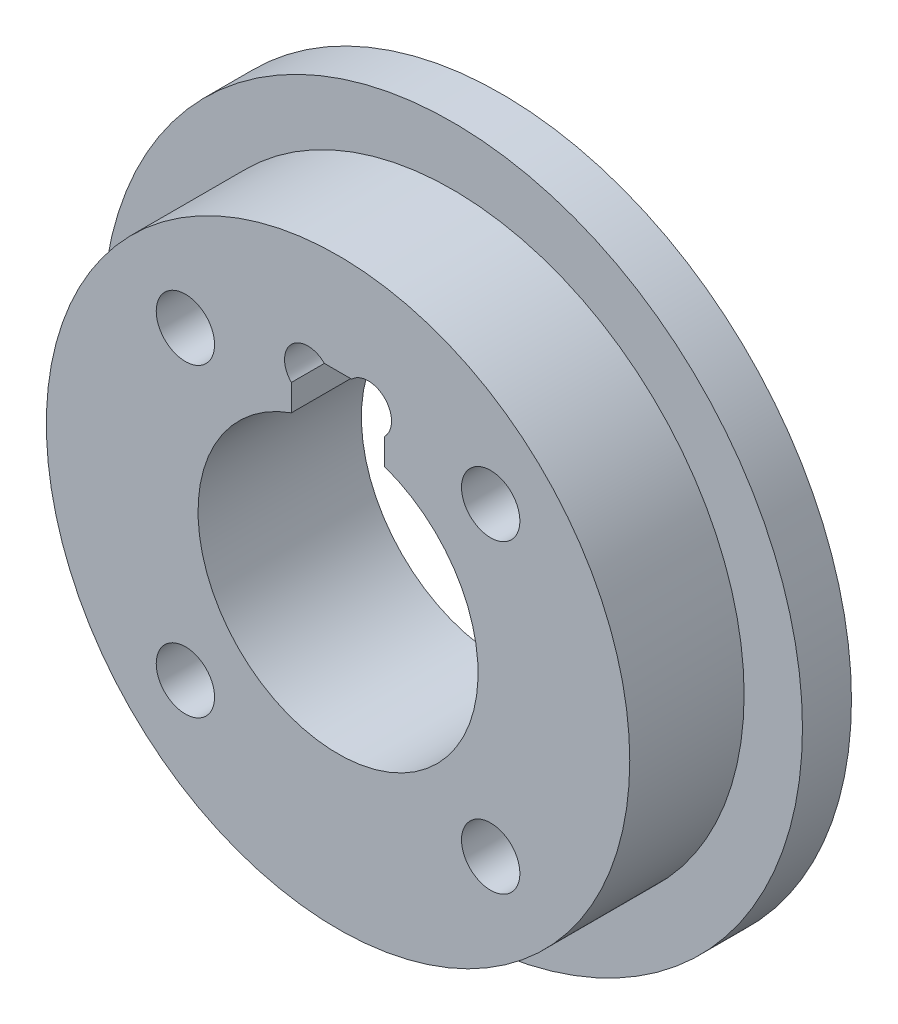
ISO-10303-21;
HEADER;
FILE_DESCRIPTION(('STEP AP214'),'2;1');
FILE_NAME('part.step','',(''),(''),'','','');
FILE_SCHEMA(('AUTOMOTIVE_DESIGN { 1 0 10303 214 1 1 1 1 }'));
ENDSEC;
DATA;
#1=APPLICATION_CONTEXT('core data for automotive mechanical design processes');
#2=APPLICATION_PROTOCOL_DEFINITION('international standard','automotive_design',2000,#1);
#3=PRODUCT_CONTEXT('',#1,'mechanical');
#4=PRODUCT('Part','Part','',(#3));
#5=PRODUCT_RELATED_PRODUCT_CATEGORY('part','',(#4));
#6=PRODUCT_DEFINITION_FORMATION('','',#4);
#7=PRODUCT_DEFINITION_CONTEXT('part definition',#1,'design');
#8=PRODUCT_DEFINITION('design','',#6,#7);
#9=PRODUCT_DEFINITION_SHAPE('','',#8);
#10=(LENGTH_UNIT() NAMED_UNIT(*) SI_UNIT(.MILLI.,.METRE.));
#11=(NAMED_UNIT(*) PLANE_ANGLE_UNIT() SI_UNIT($,.RADIAN.));
#12=(NAMED_UNIT(*) SI_UNIT($,.STERADIAN.) SOLID_ANGLE_UNIT());
#13=UNCERTAINTY_MEASURE_WITH_UNIT(LENGTH_MEASURE(1.E-05),#10,'distance_accuracy_value','');
#14=(GEOMETRIC_REPRESENTATION_CONTEXT(3) GLOBAL_UNCERTAINTY_ASSIGNED_CONTEXT((#13)) GLOBAL_UNIT_ASSIGNED_CONTEXT((#10,
#11,#12)) REPRESENTATION_CONTEXT('',''));
#15=CARTESIAN_POINT('',(0.,0.,0.));
#16=DIRECTION('',(0.,0.,1.));
#17=DIRECTION('',(1.,0.,0.));
#18=AXIS2_PLACEMENT_3D('',#15,#16,#17);
#19=CARTESIAN_POINT('',(0.,0.,-7.));
#20=DIRECTION('',(0.,0.,1.));
#21=DIRECTION('',(1.,0.,0.));
#22=AXIS2_PLACEMENT_3D('',#19,#20,#21);
#23=CYLINDRICAL_SURFACE('',#22,15.);
#24=CARTESIAN_POINT('',(0.,0.,-7.));
#25=DIRECTION('',(0.,0.,1.));
#26=DIRECTION('',(1.,0.,0.));
#27=AXIS2_PLACEMENT_3D('',#24,#25,#26);
#28=CIRCLE('',#27,15.);
#29=CARTESIAN_POINT('',(15.,0.,-7.));
#30=VERTEX_POINT('',#29);
#31=EDGE_CURVE('E12',#30,#30,#28,.T.);
#32=ORIENTED_EDGE('',*,*,#31,.T.);
#33=EDGE_LOOP('',(#32));
#34=FACE_BOUND('',#33,.T.);
#35=CARTESIAN_POINT('',(0.,0.,-4.9));
#36=DIRECTION('',(0.,0.,1.));
#37=DIRECTION('',(1.,0.,0.));
#38=AXIS2_PLACEMENT_3D('',#35,#36,#37);
#39=CIRCLE('',#38,15.);
#40=CARTESIAN_POINT('',(15.,0.,-4.9));
#41=VERTEX_POINT('',#40);
#42=EDGE_CURVE('E141',#41,#41,#39,.T.);
#43=ORIENTED_EDGE('',*,*,#42,.F.);
#44=EDGE_LOOP('',(#43));
#45=FACE_BOUND('',#44,.T.);
#46=ADVANCED_FACE('F55',(#34,#45),#23,.T.);
#47=CARTESIAN_POINT('',(0.,0.,0.));
#48=DIRECTION('',(0.,0.,1.));
#49=DIRECTION('',(1.,0.,0.));
#50=AXIS2_PLACEMENT_3D('',#47,#48,#49);
#51=PLANE('',#50);
#52=CARTESIAN_POINT('',(-6.54073772597554,6.54073772597558,0.));
#53=DIRECTION('',(0.,0.,-1.));
#54=DIRECTION('',(-1.,0.,0.));
#55=AXIS2_PLACEMENT_3D('',#52,#53,#54);
#56=CIRCLE('',#55,1.25);
#57=CARTESIAN_POINT('',(-7.79073772597554,6.54073772597558,0.));
#58=VERTEX_POINT('',#57);
#59=EDGE_CURVE('E218',#58,#58,#56,.T.);
#60=ORIENTED_EDGE('',*,*,#59,.T.);
#61=EDGE_LOOP('',(#60));
#62=FACE_BOUND('',#61,.T.);
#63=CARTESIAN_POINT('',(-6.54073772597558,-6.54073772597554,0.));
#64=DIRECTION('',(0.,0.,-1.));
#65=DIRECTION('',(-1.,0.,0.));
#66=AXIS2_PLACEMENT_3D('',#63,#64,#65);
#67=CIRCLE('',#66,1.25);
#68=CARTESIAN_POINT('',(-7.79073772597558,-6.54073772597554,0.));
#69=VERTEX_POINT('',#68);
#70=EDGE_CURVE('E212',#69,#69,#67,.T.);
#71=ORIENTED_EDGE('',*,*,#70,.T.);
#72=EDGE_LOOP('',(#71));
#73=FACE_BOUND('',#72,.T.);
#74=CARTESIAN_POINT('',(6.54073772597554,-6.54073772597558,0.));
#75=DIRECTION('',(0.,0.,-1.));
#76=DIRECTION('',(-1.,0.,0.));
#77=AXIS2_PLACEMENT_3D('',#74,#75,#76);
#78=CIRCLE('',#77,1.25);
#79=CARTESIAN_POINT('',(5.29073772597555,-6.54073772597558,0.));
#80=VERTEX_POINT('',#79);
#81=EDGE_CURVE('E206',#80,#80,#78,.T.);
#82=ORIENTED_EDGE('',*,*,#81,.T.);
#83=EDGE_LOOP('',(#82));
#84=FACE_BOUND('',#83,.T.);
#85=CARTESIAN_POINT('',(6.54073772597558,6.54073772597554,0.));
#86=DIRECTION('',(0.,0.,-1.));
#87=DIRECTION('',(-1.,0.,0.));
#88=AXIS2_PLACEMENT_3D('',#85,#86,#87);
#89=CIRCLE('',#88,1.25);
#90=CARTESIAN_POINT('',(5.29073772597559,6.54073772597554,0.));
#91=VERTEX_POINT('',#90);
#92=EDGE_CURVE('E200',#91,#91,#89,.T.);
#93=ORIENTED_EDGE('',*,*,#92,.T.);
#94=EDGE_LOOP('',(#93));
#95=FACE_BOUND('',#94,.T.);
#96=DIRECTION('',(0.,-1.,0.));
#97=VECTOR('',#96,1.);
#98=CARTESIAN_POINT('',(-2.,6.7857864376269,0.));
#99=LINE('',#98,#97);
#100=CARTESIAN_POINT('',(-2.,6.7857864376269,0.));
#101=VERTEX_POINT('',#100);
#102=CARTESIAN_POINT('',(-2.,5.65685424949238,0.));
#103=VERTEX_POINT('',#102);
#104=EDGE_CURVE('E77',#101,#103,#99,.T.);
#105=ORIENTED_EDGE('',*,*,#104,.F.);
#106=CARTESIAN_POINT('',(-1.29289321881346,7.49289321881345,0.));
#107=DIRECTION('',(0.,0.,-1.));
#108=DIRECTION('',(-1.,0.,0.));
#109=AXIS2_PLACEMENT_3D('',#106,#107,#108);
#110=CIRCLE('',#109,1.);
#111=CARTESIAN_POINT('',(-0.585786437626912,8.2,0.));
#112=VERTEX_POINT('',#111);
#113=EDGE_CURVE('E123',#101,#112,#110,.T.);
#114=ORIENTED_EDGE('',*,*,#113,.T.);
#115=DIRECTION('',(1.,0.,0.));
#116=VECTOR('',#115,1.);
#117=CARTESIAN_POINT('',(-0.585786437626912,8.2,0.));
#118=LINE('',#117,#116);
#119=CARTESIAN_POINT('',(0.585786437626912,8.2,0.));
#120=VERTEX_POINT('',#119);
#121=EDGE_CURVE('E126',#112,#120,#118,.T.);
#122=ORIENTED_EDGE('',*,*,#121,.T.);
#123=CARTESIAN_POINT('',(1.29289321881346,7.49289321881345,0.));
#124=DIRECTION('',(0.,0.,1.));
#125=DIRECTION('',(1.,0.,0.));
#126=AXIS2_PLACEMENT_3D('',#123,#124,#125);
#127=CIRCLE('',#126,1.);
#128=CARTESIAN_POINT('',(2.,6.7857864376269,0.));
#129=VERTEX_POINT('',#128);
#130=EDGE_CURVE('E146',#129,#120,#127,.T.);
#131=ORIENTED_EDGE('',*,*,#130,.F.);
#132=DIRECTION('',(0.,-1.,0.));
#133=VECTOR('',#132,1.);
#134=CARTESIAN_POINT('',(2.,6.7857864376269,0.));
#135=LINE('',#134,#133);
#136=CARTESIAN_POINT('',(2.,5.65685424949238,0.));
#137=VERTEX_POINT('',#136);
#138=EDGE_CURVE('E143',#129,#137,#135,.T.);
#139=ORIENTED_EDGE('',*,*,#138,.T.);
#140=CARTESIAN_POINT('',(0.,0.,0.));
#141=DIRECTION('',(0.,0.,1.));
#142=DIRECTION('',(1.,0.,0.));
#143=AXIS2_PLACEMENT_3D('',#140,#141,#142);
#144=CIRCLE('',#143,6.);
#145=EDGE_CURVE('E140',#103,#137,#144,.T.);
#146=ORIENTED_EDGE('',*,*,#145,.F.);
#147=EDGE_LOOP('',(#105,#114,#122,#131,#139,#146));
#148=FACE_BOUND('',#147,.T.);
#149=CARTESIAN_POINT('',(0.,0.,0.));
#150=DIRECTION('',(0.,0.,1.));
#151=DIRECTION('',(1.,0.,0.));
#152=AXIS2_PLACEMENT_3D('',#149,#150,#151);
#153=CIRCLE('',#152,12.5);
#154=CARTESIAN_POINT('',(12.5,0.,0.));
#155=VERTEX_POINT('',#154);
#156=EDGE_CURVE('E129',#155,#155,#153,.T.);
#157=ORIENTED_EDGE('',*,*,#156,.T.);
#158=EDGE_LOOP('',(#157));
#159=FACE_BOUND('',#158,.T.);
#160=ADVANCED_FACE('F163',(#62,#73,#84,#95,#148,#159),#51,.T.);
#161=CARTESIAN_POINT('',(0.,0.,-7.));
#162=DIRECTION('',(0.,0.,1.));
#163=DIRECTION('',(1.,0.,0.));
#164=AXIS2_PLACEMENT_3D('',#161,#162,#163);
#165=PLANE('',#164);
#166=CARTESIAN_POINT('',(-6.54073772597554,6.54073772597558,-7.));
#167=DIRECTION('',(0.,0.,-1.));
#168=DIRECTION('',(-1.,0.,0.));
#169=AXIS2_PLACEMENT_3D('',#166,#167,#168);
#170=CIRCLE('',#169,1.25);
#171=CARTESIAN_POINT('',(-7.79073772597554,6.54073772597558,-7.));
#172=VERTEX_POINT('',#171);
#173=EDGE_CURVE('E221',#172,#172,#170,.T.);
#174=ORIENTED_EDGE('',*,*,#173,.F.);
#175=EDGE_LOOP('',(#174));
#176=FACE_BOUND('',#175,.T.);
#177=CARTESIAN_POINT('',(-6.54073772597558,-6.54073772597554,-7.));
#178=DIRECTION('',(0.,0.,-1.));
#179=DIRECTION('',(-1.,0.,0.));
#180=AXIS2_PLACEMENT_3D('',#177,#178,#179);
#181=CIRCLE('',#180,1.25);
#182=CARTESIAN_POINT('',(-7.79073772597558,-6.54073772597554,-7.));
#183=VERTEX_POINT('',#182);
#184=EDGE_CURVE('E215',#183,#183,#181,.T.);
#185=ORIENTED_EDGE('',*,*,#184,.F.);
#186=EDGE_LOOP('',(#185));
#187=FACE_BOUND('',#186,.T.);
#188=CARTESIAN_POINT('',(6.54073772597554,-6.54073772597558,-7.));
#189=DIRECTION('',(0.,0.,-1.));
#190=DIRECTION('',(-1.,0.,0.));
#191=AXIS2_PLACEMENT_3D('',#188,#189,#190);
#192=CIRCLE('',#191,1.25);
#193=CARTESIAN_POINT('',(5.29073772597555,-6.54073772597558,-7.));
#194=VERTEX_POINT('',#193);
#195=EDGE_CURVE('E209',#194,#194,#192,.T.);
#196=ORIENTED_EDGE('',*,*,#195,.F.);
#197=EDGE_LOOP('',(#196));
#198=FACE_BOUND('',#197,.T.);
#199=CARTESIAN_POINT('',(6.54073772597558,6.54073772597554,-7.));
#200=DIRECTION('',(0.,0.,-1.));
#201=DIRECTION('',(-1.,0.,0.));
#202=AXIS2_PLACEMENT_3D('',#199,#200,#201);
#203=CIRCLE('',#202,1.25);
#204=CARTESIAN_POINT('',(5.29073772597558,6.54073772597554,-7.));
#205=VERTEX_POINT('',#204);
#206=EDGE_CURVE('E203',#205,#205,#203,.T.);
#207=ORIENTED_EDGE('',*,*,#206,.F.);
#208=EDGE_LOOP('',(#207));
#209=FACE_BOUND('',#208,.T.);
#210=CARTESIAN_POINT('',(-1.29289321881346,7.49289321881345,-7.));
#211=DIRECTION('',(0.,0.,-1.));
#212=DIRECTION('',(-1.,0.,0.));
#213=AXIS2_PLACEMENT_3D('',#210,#211,#212);
#214=CIRCLE('',#213,1.);
#215=CARTESIAN_POINT('',(-2.,6.7857864376269,-7.));
#216=VERTEX_POINT('',#215);
#217=CARTESIAN_POINT('',(-0.585786437626912,8.2,-7.));
#218=VERTEX_POINT('',#217);
#219=EDGE_CURVE('E112',#216,#218,#214,.T.);
#220=ORIENTED_EDGE('',*,*,#219,.F.);
#221=DIRECTION('',(0.,-1.,0.));
#222=VECTOR('',#221,1.);
#223=CARTESIAN_POINT('',(-2.,6.7857864376269,-7.));
#224=LINE('',#223,#222);
#225=CARTESIAN_POINT('',(-2.,5.65685424949238,-7.));
#226=VERTEX_POINT('',#225);
#227=EDGE_CURVE('E109',#216,#226,#224,.T.);
#228=ORIENTED_EDGE('',*,*,#227,.T.);
#229=CARTESIAN_POINT('',(0.,0.,-7.));
#230=DIRECTION('',(0.,0.,1.));
#231=DIRECTION('',(1.,0.,0.));
#232=AXIS2_PLACEMENT_3D('',#229,#230,#231);
#233=CIRCLE('',#232,6.);
#234=CARTESIAN_POINT('',(2.,5.65685424949238,-7.));
#235=VERTEX_POINT('',#234);
#236=EDGE_CURVE('E114',#226,#235,#233,.T.);
#237=ORIENTED_EDGE('',*,*,#236,.T.);
#238=DIRECTION('',(0.,-1.,0.));
#239=VECTOR('',#238,1.);
#240=CARTESIAN_POINT('',(2.,6.7857864376269,-7.));
#241=LINE('',#240,#239);
#242=CARTESIAN_POINT('',(2.,6.7857864376269,-7.));
#243=VERTEX_POINT('',#242);
#244=EDGE_CURVE('E118',#243,#235,#241,.T.);
#245=ORIENTED_EDGE('',*,*,#244,.F.);
#246=CARTESIAN_POINT('',(1.29289321881346,7.49289321881345,-7.));
#247=DIRECTION('',(0.,0.,1.));
#248=DIRECTION('',(1.,0.,0.));
#249=AXIS2_PLACEMENT_3D('',#246,#247,#248);
#250=CIRCLE('',#249,1.);
#251=CARTESIAN_POINT('',(0.585786437626912,8.2,-7.));
#252=VERTEX_POINT('',#251);
#253=EDGE_CURVE('E133',#243,#252,#250,.T.);
#254=ORIENTED_EDGE('',*,*,#253,.T.);
#255=DIRECTION('',(1.,0.,0.));
#256=VECTOR('',#255,1.);
#257=CARTESIAN_POINT('',(-0.585786437626912,8.2,-7.));
#258=LINE('',#257,#256);
#259=EDGE_CURVE('E136',#218,#252,#258,.T.);
#260=ORIENTED_EDGE('',*,*,#259,.F.);
#261=EDGE_LOOP('',(#220,#228,#237,#245,#254,#260));
#262=FACE_BOUND('',#261,.T.);
#263=ORIENTED_EDGE('',*,*,#31,.F.);
#264=EDGE_LOOP('',(#263));
#265=FACE_BOUND('',#264,.T.);
#266=ADVANCED_FACE('F120',(#176,#187,#198,#209,#262,#265),#165,.F.);
#267=CARTESIAN_POINT('',(-2.,6.7857864376269,-7.));
#268=DIRECTION('',(-1.,0.,0.));
#269=DIRECTION('',(0.,-1.,0.));
#270=AXIS2_PLACEMENT_3D('',#267,#268,#269);
#271=PLANE('',#270);
#272=ORIENTED_EDGE('',*,*,#104,.T.);
#273=DIRECTION('',(0.,0.,1.));
#274=VECTOR('',#273,1.);
#275=CARTESIAN_POINT('',(-2.,5.65685424949238,-7.));
#276=LINE('',#275,#274);
#277=EDGE_CURVE('E106',#226,#103,#276,.T.);
#278=ORIENTED_EDGE('',*,*,#277,.F.);
#279=ORIENTED_EDGE('',*,*,#227,.F.);
#280=DIRECTION('',(0.,0.,1.));
#281=VECTOR('',#280,1.);
#282=CARTESIAN_POINT('',(-2.,6.7857864376269,-7.));
#283=LINE('',#282,#281);
#284=EDGE_CURVE('E62',#216,#101,#283,.T.);
#285=ORIENTED_EDGE('',*,*,#284,.T.);
#286=EDGE_LOOP('',(#272,#278,#279,#285));
#287=FACE_BOUND('',#286,.T.);
#288=ADVANCED_FACE('F107',(#287),#271,.F.);
#289=CARTESIAN_POINT('',(-1.29289321881346,7.49289321881345,-7.));
#290=DIRECTION('',(0.,0.,1.));
#291=DIRECTION('',(1.,0.,0.));
#292=AXIS2_PLACEMENT_3D('',#289,#290,#291);
#293=CYLINDRICAL_SURFACE('',#292,1.);
#294=ORIENTED_EDGE('',*,*,#113,.F.);
#295=ORIENTED_EDGE('',*,*,#284,.F.);
#296=ORIENTED_EDGE('',*,*,#219,.T.);
#297=DIRECTION('',(0.,0.,1.));
#298=VECTOR('',#297,1.);
#299=CARTESIAN_POINT('',(-0.585786437626912,8.2,-7.));
#300=LINE('',#299,#298);
#301=EDGE_CURVE('E152',#218,#112,#300,.T.);
#302=ORIENTED_EDGE('',*,*,#301,.T.);
#303=EDGE_LOOP('',(#294,#295,#296,#302));
#304=FACE_BOUND('',#303,.T.);
#305=ADVANCED_FACE('F175',(#304),#293,.F.);
#306=CARTESIAN_POINT('',(-0.585786437626912,8.2,-7.));
#307=DIRECTION('',(0.,-1.,0.));
#308=DIRECTION('',(0.,0.,-1.));
#309=AXIS2_PLACEMENT_3D('',#306,#307,#308);
#310=PLANE('',#309);
#311=ORIENTED_EDGE('',*,*,#121,.F.);
#312=ORIENTED_EDGE('',*,*,#301,.F.);
#313=ORIENTED_EDGE('',*,*,#259,.T.);
#314=DIRECTION('',(0.,0.,1.));
#315=VECTOR('',#314,1.);
#316=CARTESIAN_POINT('',(0.585786437626912,8.2,-7.));
#317=LINE('',#316,#315);
#318=EDGE_CURVE('E154',#252,#120,#317,.T.);
#319=ORIENTED_EDGE('',*,*,#318,.T.);
#320=EDGE_LOOP('',(#311,#312,#313,#319));
#321=FACE_BOUND('',#320,.T.);
#322=ADVANCED_FACE('F172',(#321),#310,.T.);
#323=CARTESIAN_POINT('',(1.29289321881346,7.49289321881345,-7.));
#324=DIRECTION('',(0.,0.,1.));
#325=DIRECTION('',(1.,0.,0.));
#326=AXIS2_PLACEMENT_3D('',#323,#324,#325);
#327=CYLINDRICAL_SURFACE('',#326,1.);
#328=ORIENTED_EDGE('',*,*,#130,.T.);
#329=ORIENTED_EDGE('',*,*,#318,.F.);
#330=ORIENTED_EDGE('',*,*,#253,.F.);
#331=DIRECTION('',(0.,0.,1.));
#332=VECTOR('',#331,1.);
#333=CARTESIAN_POINT('',(2.,6.7857864376269,-7.));
#334=LINE('',#333,#332);
#335=EDGE_CURVE('E156',#243,#129,#334,.T.);
#336=ORIENTED_EDGE('',*,*,#335,.T.);
#337=EDGE_LOOP('',(#328,#329,#330,#336));
#338=FACE_BOUND('',#337,.T.);
#339=ADVANCED_FACE('F168',(#338),#327,.F.);
#340=CARTESIAN_POINT('',(2.,6.7857864376269,-7.));
#341=DIRECTION('',(-1.,0.,0.));
#342=DIRECTION('',(0.,-1.,0.));
#343=AXIS2_PLACEMENT_3D('',#340,#341,#342);
#344=PLANE('',#343);
#345=ORIENTED_EDGE('',*,*,#138,.F.);
#346=ORIENTED_EDGE('',*,*,#335,.F.);
#347=ORIENTED_EDGE('',*,*,#244,.T.);
#348=DIRECTION('',(0.,0.,1.));
#349=VECTOR('',#348,1.);
#350=CARTESIAN_POINT('',(2.,5.65685424949238,-7.));
#351=LINE('',#350,#349);
#352=EDGE_CURVE('E69',#235,#137,#351,.T.);
#353=ORIENTED_EDGE('',*,*,#352,.T.);
#354=EDGE_LOOP('',(#345,#346,#347,#353));
#355=FACE_BOUND('',#354,.T.);
#356=ADVANCED_FACE('F160',(#355),#344,.T.);
#357=CARTESIAN_POINT('',(0.,0.,-7.));
#358=DIRECTION('',(0.,0.,1.));
#359=DIRECTION('',(1.,0.,0.));
#360=AXIS2_PLACEMENT_3D('',#357,#358,#359);
#361=CYLINDRICAL_SURFACE('',#360,6.);
#362=ORIENTED_EDGE('',*,*,#145,.T.);
#363=ORIENTED_EDGE('',*,*,#352,.F.);
#364=ORIENTED_EDGE('',*,*,#236,.F.);
#365=ORIENTED_EDGE('',*,*,#277,.T.);
#366=EDGE_LOOP('',(#362,#363,#364,#365));
#367=FACE_BOUND('',#366,.T.);
#368=ADVANCED_FACE('F115',(#367),#361,.F.);
#369=CARTESIAN_POINT('',(0.,0.,-4.9));
#370=DIRECTION('',(0.,0.,1.));
#371=DIRECTION('',(1.,0.,0.));
#372=AXIS2_PLACEMENT_3D('',#369,#370,#371);
#373=CYLINDRICAL_SURFACE('',#372,12.5);
#374=CARTESIAN_POINT('',(0.,0.,-4.9));
#375=DIRECTION('',(0.,0.,1.));
#376=DIRECTION('',(1.,0.,0.));
#377=AXIS2_PLACEMENT_3D('',#374,#375,#376);
#378=CIRCLE('',#377,12.5);
#379=CARTESIAN_POINT('',(12.5,0.,-4.9));
#380=VERTEX_POINT('',#379);
#381=EDGE_CURVE('E196',#380,#380,#378,.T.);
#382=ORIENTED_EDGE('',*,*,#381,.T.);
#383=EDGE_LOOP('',(#382));
#384=FACE_BOUND('',#383,.T.);
#385=ORIENTED_EDGE('',*,*,#156,.F.);
#386=EDGE_LOOP('',(#385));
#387=FACE_BOUND('',#386,.T.);
#388=ADVANCED_FACE('F249',(#384,#387),#373,.T.);
#389=CARTESIAN_POINT('',(0.,0.,-4.9));
#390=DIRECTION('',(0.,0.,1.));
#391=DIRECTION('',(1.,0.,0.));
#392=AXIS2_PLACEMENT_3D('',#389,#390,#391);
#393=PLANE('',#392);
#394=ORIENTED_EDGE('',*,*,#381,.F.);
#395=EDGE_LOOP('',(#394));
#396=FACE_BOUND('',#395,.T.);
#397=ORIENTED_EDGE('',*,*,#42,.T.);
#398=EDGE_LOOP('',(#397));
#399=FACE_BOUND('',#398,.T.);
#400=ADVANCED_FACE('F239',(#396,#399),#393,.T.);
#401=CARTESIAN_POINT('',(6.54073772597558,6.54073772597554,-7.));
#402=DIRECTION('',(0.,0.,-1.));
#403=DIRECTION('',(-1.,0.,0.));
#404=AXIS2_PLACEMENT_3D('',#401,#402,#403);
#405=CYLINDRICAL_SURFACE('',#404,1.25);
#406=ORIENTED_EDGE('',*,*,#92,.F.);
#407=EDGE_LOOP('',(#406));
#408=FACE_BOUND('',#407,.T.);
#409=ORIENTED_EDGE('',*,*,#206,.T.);
#410=EDGE_LOOP('',(#409));
#411=FACE_BOUND('',#410,.T.);
#412=ADVANCED_FACE('F236',(#408,#411),#405,.F.);
#413=CARTESIAN_POINT('',(6.54073772597554,-6.54073772597558,-7.));
#414=DIRECTION('',(0.,0.,-1.));
#415=DIRECTION('',(-1.,0.,0.));
#416=AXIS2_PLACEMENT_3D('',#413,#414,#415);
#417=CYLINDRICAL_SURFACE('',#416,1.25);
#418=ORIENTED_EDGE('',*,*,#81,.F.);
#419=EDGE_LOOP('',(#418));
#420=FACE_BOUND('',#419,.T.);
#421=ORIENTED_EDGE('',*,*,#195,.T.);
#422=EDGE_LOOP('',(#421));
#423=FACE_BOUND('',#422,.T.);
#424=ADVANCED_FACE('F238',(#420,#423),#417,.F.);
#425=CARTESIAN_POINT('',(-6.54073772597558,-6.54073772597554,-7.));
#426=DIRECTION('',(0.,0.,-1.));
#427=DIRECTION('',(-1.,0.,0.));
#428=AXIS2_PLACEMENT_3D('',#425,#426,#427);
#429=CYLINDRICAL_SURFACE('',#428,1.25);
#430=ORIENTED_EDGE('',*,*,#70,.F.);
#431=EDGE_LOOP('',(#430));
#432=FACE_BOUND('',#431,.T.);
#433=ORIENTED_EDGE('',*,*,#184,.T.);
#434=EDGE_LOOP('',(#433));
#435=FACE_BOUND('',#434,.T.);
#436=ADVANCED_FACE('F246',(#432,#435),#429,.F.);
#437=CARTESIAN_POINT('',(-6.54073772597554,6.54073772597558,-7.));
#438=DIRECTION('',(0.,0.,-1.));
#439=DIRECTION('',(-1.,0.,0.));
#440=AXIS2_PLACEMENT_3D('',#437,#438,#439);
#441=CYLINDRICAL_SURFACE('',#440,1.25);
#442=ORIENTED_EDGE('',*,*,#59,.F.);
#443=EDGE_LOOP('',(#442));
#444=FACE_BOUND('',#443,.T.);
#445=ORIENTED_EDGE('',*,*,#173,.T.);
#446=EDGE_LOOP('',(#445));
#447=FACE_BOUND('',#446,.T.);
#448=ADVANCED_FACE('F225',(#444,#447),#441,.F.);
#449=CLOSED_SHELL('',(#46,#160,#266,#288,#305,#322,#339,#356,#368,#388,#400,#412,#424,#436,#448));
#450=MANIFOLD_SOLID_BREP('B2',#449);
#451=ADVANCED_BREP_SHAPE_REPRESENTATION('',(#18,#450),#14);
#452=SHAPE_DEFINITION_REPRESENTATION(#9,#451);
ENDSEC;
END-ISO-10303-21;
